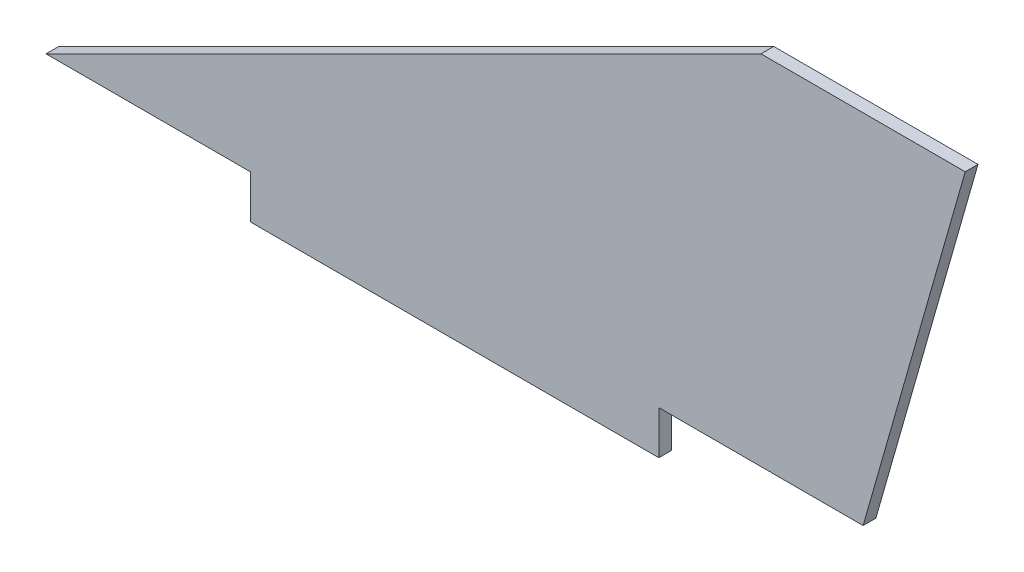
ISO-10303-21;
HEADER;
FILE_DESCRIPTION(('STEP AP214'),'2;1');
FILE_NAME('part.step','',(''),(''),'','','');
FILE_SCHEMA(('AUTOMOTIVE_DESIGN { 1 0 10303 214 1 1 1 1 }'));
ENDSEC;
DATA;
#1=APPLICATION_CONTEXT('core data for automotive mechanical design processes');
#2=APPLICATION_PROTOCOL_DEFINITION('international standard','automotive_design',2000,#1);
#3=PRODUCT_CONTEXT('',#1,'mechanical');
#4=PRODUCT('Part','Part','',(#3));
#5=PRODUCT_RELATED_PRODUCT_CATEGORY('part','',(#4));
#6=PRODUCT_DEFINITION_FORMATION('','',#4);
#7=PRODUCT_DEFINITION_CONTEXT('part definition',#1,'design');
#8=PRODUCT_DEFINITION('design','',#6,#7);
#9=PRODUCT_DEFINITION_SHAPE('','',#8);
#10=(LENGTH_UNIT() NAMED_UNIT(*) SI_UNIT(.MILLI.,.METRE.));
#11=(NAMED_UNIT(*) PLANE_ANGLE_UNIT() SI_UNIT($,.RADIAN.));
#12=(NAMED_UNIT(*) SI_UNIT($,.STERADIAN.) SOLID_ANGLE_UNIT());
#13=UNCERTAINTY_MEASURE_WITH_UNIT(LENGTH_MEASURE(1.E-05),#10,'distance_accuracy_value','');
#14=(GEOMETRIC_REPRESENTATION_CONTEXT(3) GLOBAL_UNCERTAINTY_ASSIGNED_CONTEXT((#13)) GLOBAL_UNIT_ASSIGNED_CONTEXT((#10,
#11,#12)) REPRESENTATION_CONTEXT('',''));
#15=CARTESIAN_POINT('',(0.,0.,0.));
#16=DIRECTION('',(0.,0.,1.));
#17=DIRECTION('',(1.,0.,0.));
#18=AXIS2_PLACEMENT_3D('',#15,#16,#17);
#19=CARTESIAN_POINT('',(177.8,88.9,3.175));
#20=DIRECTION('',(0.447213595499958,-0.894427190999916,0.));
#21=DIRECTION('',(0.894427190999916,0.447213595499958,0.));
#22=AXIS2_PLACEMENT_3D('',#19,#20,#21);
#23=PLANE('',#22);
#24=DIRECTION('',(-0.894427190999916,-0.447213595499958,0.));
#25=VECTOR('',#24,1.);
#26=CARTESIAN_POINT('',(177.8,88.9,0.));
#27=LINE('',#26,#25);
#28=CARTESIAN_POINT('',(177.8,88.9,0.));
#29=VERTEX_POINT('',#28);
#30=CARTESIAN_POINT('',(0.,0.,0.));
#31=VERTEX_POINT('',#30);
#32=EDGE_CURVE('E144',#29,#31,#27,.T.);
#33=ORIENTED_EDGE('',*,*,#32,.T.);
#34=DIRECTION('',(0.,0.,-1.));
#35=VECTOR('',#34,1.);
#36=CARTESIAN_POINT('',(0.,0.,3.175));
#37=LINE('',#36,#35);
#38=CARTESIAN_POINT('',(0.,0.,3.175));
#39=VERTEX_POINT('',#38);
#40=EDGE_CURVE('E11',#39,#31,#37,.T.);
#41=ORIENTED_EDGE('',*,*,#40,.F.);
#42=DIRECTION('',(-0.894427190999916,-0.447213595499958,0.));
#43=VECTOR('',#42,1.);
#44=CARTESIAN_POINT('',(177.8,88.9,3.175));
#45=LINE('',#44,#43);
#46=CARTESIAN_POINT('',(177.8,88.9,3.175));
#47=VERTEX_POINT('',#46);
#48=EDGE_CURVE('E166',#47,#39,#45,.T.);
#49=ORIENTED_EDGE('',*,*,#48,.F.);
#50=DIRECTION('',(0.,0.,-1.));
#51=VECTOR('',#50,1.);
#52=CARTESIAN_POINT('',(177.8,88.9,3.175));
#53=LINE('',#52,#51);
#54=EDGE_CURVE('E140',#47,#29,#53,.T.);
#55=ORIENTED_EDGE('',*,*,#54,.T.);
#56=EDGE_LOOP('',(#33,#41,#49,#55));
#57=FACE_BOUND('',#56,.T.);
#58=ADVANCED_FACE('F43',(#57),#23,.F.);
#59=CARTESIAN_POINT('',(0.,0.,3.175));
#60=DIRECTION('',(0.,1.,0.));
#61=DIRECTION('',(0.,0.,1.));
#62=AXIS2_PLACEMENT_3D('',#59,#60,#61);
#63=PLANE('',#62);
#64=DIRECTION('',(1.,0.,0.));
#65=VECTOR('',#64,1.);
#66=CARTESIAN_POINT('',(0.,0.,0.));
#67=LINE('',#66,#65);
#68=CARTESIAN_POINT('',(50.8,0.,0.));
#69=VERTEX_POINT('',#68);
#70=EDGE_CURVE('E148',#31,#69,#67,.T.);
#71=ORIENTED_EDGE('',*,*,#70,.T.);
#72=DIRECTION('',(0.,0.,-1.));
#73=VECTOR('',#72,1.);
#74=CARTESIAN_POINT('',(50.8,0.,3.175));
#75=LINE('',#74,#73);
#76=CARTESIAN_POINT('',(50.8,0.,3.175));
#77=VERTEX_POINT('',#76);
#78=EDGE_CURVE('E52',#77,#69,#75,.T.);
#79=ORIENTED_EDGE('',*,*,#78,.F.);
#80=DIRECTION('',(1.,0.,0.));
#81=VECTOR('',#80,1.);
#82=CARTESIAN_POINT('',(0.,0.,3.175));
#83=LINE('',#82,#81);
#84=EDGE_CURVE('E103',#39,#77,#83,.T.);
#85=ORIENTED_EDGE('',*,*,#84,.F.);
#86=ORIENTED_EDGE('',*,*,#40,.T.);
#87=EDGE_LOOP('',(#71,#79,#85,#86));
#88=FACE_BOUND('',#87,.T.);
#89=ADVANCED_FACE('F212',(#88),#63,.F.);
#90=CARTESIAN_POINT('',(50.8,0.,3.175));
#91=DIRECTION('',(1.,0.,0.));
#92=DIRECTION('',(0.,1.,0.));
#93=AXIS2_PLACEMENT_3D('',#90,#91,#92);
#94=PLANE('',#93);
#95=DIRECTION('',(0.,-1.,0.));
#96=VECTOR('',#95,1.);
#97=CARTESIAN_POINT('',(50.8,0.,0.));
#98=LINE('',#97,#96);
#99=CARTESIAN_POINT('',(50.8000000000001,-10.795,0.));
#100=VERTEX_POINT('',#99);
#101=EDGE_CURVE('E151',#69,#100,#98,.T.);
#102=ORIENTED_EDGE('',*,*,#101,.T.);
#103=DIRECTION('',(0.,0.,-1.));
#104=VECTOR('',#103,1.);
#105=CARTESIAN_POINT('',(50.8000000000001,-10.795,3.175));
#106=LINE('',#105,#104);
#107=CARTESIAN_POINT('',(50.8000000000001,-10.795,3.175));
#108=VERTEX_POINT('',#107);
#109=EDGE_CURVE('E177',#108,#100,#106,.T.);
#110=ORIENTED_EDGE('',*,*,#109,.F.);
#111=DIRECTION('',(0.,-1.,0.));
#112=VECTOR('',#111,1.);
#113=CARTESIAN_POINT('',(50.8,0.,3.175));
#114=LINE('',#113,#112);
#115=EDGE_CURVE('E187',#77,#108,#114,.T.);
#116=ORIENTED_EDGE('',*,*,#115,.F.);
#117=ORIENTED_EDGE('',*,*,#78,.T.);
#118=EDGE_LOOP('',(#102,#110,#116,#117));
#119=FACE_BOUND('',#118,.T.);
#120=ADVANCED_FACE('F185',(#119),#94,.F.);
#121=CARTESIAN_POINT('',(50.8000000000001,-10.795,3.175));
#122=DIRECTION('',(0.,1.,0.));
#123=DIRECTION('',(0.,0.,1.));
#124=AXIS2_PLACEMENT_3D('',#121,#122,#123);
#125=PLANE('',#124);
#126=DIRECTION('',(1.,0.,0.));
#127=VECTOR('',#126,1.);
#128=CARTESIAN_POINT('',(50.8000000000001,-10.795,0.));
#129=LINE('',#128,#127);
#130=CARTESIAN_POINT('',(152.4,-10.795,0.));
#131=VERTEX_POINT('',#130);
#132=EDGE_CURVE('E154',#100,#131,#129,.T.);
#133=ORIENTED_EDGE('',*,*,#132,.T.);
#134=DIRECTION('',(0.,0.,-1.));
#135=VECTOR('',#134,1.);
#136=CARTESIAN_POINT('',(152.4,-10.795,3.175));
#137=LINE('',#136,#135);
#138=CARTESIAN_POINT('',(152.4,-10.795,3.175));
#139=VERTEX_POINT('',#138);
#140=EDGE_CURVE('E173',#139,#131,#137,.T.);
#141=ORIENTED_EDGE('',*,*,#140,.F.);
#142=DIRECTION('',(1.,0.,0.));
#143=VECTOR('',#142,1.);
#144=CARTESIAN_POINT('',(50.8000000000001,-10.795,3.175));
#145=LINE('',#144,#143);
#146=EDGE_CURVE('E200',#108,#139,#145,.T.);
#147=ORIENTED_EDGE('',*,*,#146,.F.);
#148=ORIENTED_EDGE('',*,*,#109,.T.);
#149=EDGE_LOOP('',(#133,#141,#147,#148));
#150=FACE_BOUND('',#149,.T.);
#151=ADVANCED_FACE('F195',(#150),#125,.F.);
#152=CARTESIAN_POINT('',(152.4,-10.795,3.175));
#153=DIRECTION('',(-1.,0.,0.));
#154=DIRECTION('',(0.,0.,1.));
#155=AXIS2_PLACEMENT_3D('',#152,#153,#154);
#156=PLANE('',#155);
#157=DIRECTION('',(0.,1.,0.));
#158=VECTOR('',#157,1.);
#159=CARTESIAN_POINT('',(152.4,-10.795,0.));
#160=LINE('',#159,#158);
#161=CARTESIAN_POINT('',(152.4,0.,0.));
#162=VERTEX_POINT('',#161);
#163=EDGE_CURVE('E157',#131,#162,#160,.T.);
#164=ORIENTED_EDGE('',*,*,#163,.T.);
#165=DIRECTION('',(0.,0.,-1.));
#166=VECTOR('',#165,1.);
#167=CARTESIAN_POINT('',(152.4,0.,3.175));
#168=LINE('',#167,#166);
#169=CARTESIAN_POINT('',(152.4,0.,3.175));
#170=VERTEX_POINT('',#169);
#171=EDGE_CURVE('E133',#170,#162,#168,.T.);
#172=ORIENTED_EDGE('',*,*,#171,.F.);
#173=DIRECTION('',(0.,1.,0.));
#174=VECTOR('',#173,1.);
#175=CARTESIAN_POINT('',(152.4,-10.795,3.175));
#176=LINE('',#175,#174);
#177=EDGE_CURVE('E122',#139,#170,#176,.T.);
#178=ORIENTED_EDGE('',*,*,#177,.F.);
#179=ORIENTED_EDGE('',*,*,#140,.T.);
#180=EDGE_LOOP('',(#164,#172,#178,#179));
#181=FACE_BOUND('',#180,.T.);
#182=ADVANCED_FACE('F198',(#181),#156,.F.);
#183=CARTESIAN_POINT('',(152.4,0.,3.175));
#184=DIRECTION('',(0.,1.,0.));
#185=DIRECTION('',(0.,0.,1.));
#186=AXIS2_PLACEMENT_3D('',#183,#184,#185);
#187=PLANE('',#186);
#188=DIRECTION('',(1.,0.,0.));
#189=VECTOR('',#188,1.);
#190=CARTESIAN_POINT('',(152.4,0.,0.));
#191=LINE('',#190,#189);
#192=CARTESIAN_POINT('',(203.2,0.,0.));
#193=VERTEX_POINT('',#192);
#194=EDGE_CURVE('E131',#162,#193,#191,.T.);
#195=ORIENTED_EDGE('',*,*,#194,.T.);
#196=DIRECTION('',(0.,0.,-1.));
#197=VECTOR('',#196,1.);
#198=CARTESIAN_POINT('',(203.2,0.,3.175));
#199=LINE('',#198,#197);
#200=CARTESIAN_POINT('',(203.2,0.,3.175));
#201=VERTEX_POINT('',#200);
#202=EDGE_CURVE('E128',#201,#193,#199,.T.);
#203=ORIENTED_EDGE('',*,*,#202,.F.);
#204=DIRECTION('',(1.,0.,0.));
#205=VECTOR('',#204,1.);
#206=CARTESIAN_POINT('',(152.4,0.,3.175));
#207=LINE('',#206,#205);
#208=EDGE_CURVE('E116',#170,#201,#207,.T.);
#209=ORIENTED_EDGE('',*,*,#208,.F.);
#210=ORIENTED_EDGE('',*,*,#171,.T.);
#211=EDGE_LOOP('',(#195,#203,#209,#210));
#212=FACE_BOUND('',#211,.T.);
#213=ADVANCED_FACE('F129',(#212),#187,.F.);
#214=CARTESIAN_POINT('',(203.2,0.,3.175));
#215=DIRECTION('',(-0.961523947640823,0.274721127897377,0.));
#216=DIRECTION('',(-0.274721127897377,-0.961523947640823,0.));
#217=AXIS2_PLACEMENT_3D('',#214,#215,#216);
#218=PLANE('',#217);
#219=DIRECTION('',(0.274721127897377,0.961523947640824,0.));
#220=VECTOR('',#219,1.);
#221=CARTESIAN_POINT('',(203.2,0.,0.));
#222=LINE('',#221,#220);
#223=CARTESIAN_POINT('',(228.6,88.9,0.));
#224=VERTEX_POINT('',#223);
#225=EDGE_CURVE('E89',#193,#224,#222,.T.);
#226=ORIENTED_EDGE('',*,*,#225,.T.);
#227=DIRECTION('',(0.,0.,-1.));
#228=VECTOR('',#227,1.);
#229=CARTESIAN_POINT('',(228.6,88.9,3.175));
#230=LINE('',#229,#228);
#231=CARTESIAN_POINT('',(228.6,88.9,3.175));
#232=VERTEX_POINT('',#231);
#233=EDGE_CURVE('E134',#232,#224,#230,.T.);
#234=ORIENTED_EDGE('',*,*,#233,.F.);
#235=DIRECTION('',(0.274721127897377,0.961523947640824,0.));
#236=VECTOR('',#235,1.);
#237=CARTESIAN_POINT('',(203.2,0.,3.175));
#238=LINE('',#237,#236);
#239=EDGE_CURVE('E120',#201,#232,#238,.T.);
#240=ORIENTED_EDGE('',*,*,#239,.F.);
#241=ORIENTED_EDGE('',*,*,#202,.T.);
#242=EDGE_LOOP('',(#226,#234,#240,#241));
#243=FACE_BOUND('',#242,.T.);
#244=ADVANCED_FACE('F136',(#243),#218,.F.);
#245=CARTESIAN_POINT('',(228.6,88.9,3.175));
#246=DIRECTION('',(0.,-1.,0.));
#247=DIRECTION('',(1.,0.,0.));
#248=AXIS2_PLACEMENT_3D('',#245,#246,#247);
#249=PLANE('',#248);
#250=DIRECTION('',(-1.,0.,0.));
#251=VECTOR('',#250,1.);
#252=CARTESIAN_POINT('',(228.6,88.9,0.));
#253=LINE('',#252,#251);
#254=EDGE_CURVE('E95',#224,#29,#253,.T.);
#255=ORIENTED_EDGE('',*,*,#254,.T.);
#256=ORIENTED_EDGE('',*,*,#54,.F.);
#257=DIRECTION('',(-1.,0.,0.));
#258=VECTOR('',#257,1.);
#259=CARTESIAN_POINT('',(228.6,88.9,3.175));
#260=LINE('',#259,#258);
#261=EDGE_CURVE('E60',#232,#47,#260,.T.);
#262=ORIENTED_EDGE('',*,*,#261,.F.);
#263=ORIENTED_EDGE('',*,*,#233,.T.);
#264=EDGE_LOOP('',(#255,#256,#262,#263));
#265=FACE_BOUND('',#264,.T.);
#266=ADVANCED_FACE('F228',(#265),#249,.F.);
#267=CARTESIAN_POINT('',(0.,0.,3.175));
#268=DIRECTION('',(0.,0.,1.));
#269=DIRECTION('',(1.,0.,0.));
#270=AXIS2_PLACEMENT_3D('',#267,#268,#269);
#271=PLANE('',#270);
#272=ORIENTED_EDGE('',*,*,#48,.T.);
#273=ORIENTED_EDGE('',*,*,#84,.T.);
#274=ORIENTED_EDGE('',*,*,#115,.T.);
#275=ORIENTED_EDGE('',*,*,#146,.T.);
#276=ORIENTED_EDGE('',*,*,#177,.T.);
#277=ORIENTED_EDGE('',*,*,#208,.T.);
#278=ORIENTED_EDGE('',*,*,#239,.T.);
#279=ORIENTED_EDGE('',*,*,#261,.T.);
#280=EDGE_LOOP('',(#272,#273,#274,#275,#276,#277,#278,#279));
#281=FACE_BOUND('',#280,.T.);
#282=ADVANCED_FACE('F118',(#281),#271,.T.);
#283=CARTESIAN_POINT('',(0.,0.,0.));
#284=DIRECTION('',(0.,0.,1.));
#285=DIRECTION('',(1.,0.,0.));
#286=AXIS2_PLACEMENT_3D('',#283,#284,#285);
#287=PLANE('',#286);
#288=ORIENTED_EDGE('',*,*,#32,.F.);
#289=ORIENTED_EDGE('',*,*,#254,.F.);
#290=ORIENTED_EDGE('',*,*,#225,.F.);
#291=ORIENTED_EDGE('',*,*,#194,.F.);
#292=ORIENTED_EDGE('',*,*,#163,.F.);
#293=ORIENTED_EDGE('',*,*,#132,.F.);
#294=ORIENTED_EDGE('',*,*,#101,.F.);
#295=ORIENTED_EDGE('',*,*,#70,.F.);
#296=EDGE_LOOP('',(#288,#289,#290,#291,#292,#293,#294,#295));
#297=FACE_BOUND('',#296,.T.);
#298=ADVANCED_FACE('F191',(#297),#287,.F.);
#299=CLOSED_SHELL('',(#58,#89,#120,#151,#182,#213,#244,#266,#282,#298));
#300=MANIFOLD_SOLID_BREP('B2',#299);
#301=ADVANCED_BREP_SHAPE_REPRESENTATION('',(#18,#300),#14);
#302=SHAPE_DEFINITION_REPRESENTATION(#9,#301);
ENDSEC;
END-ISO-10303-21;
